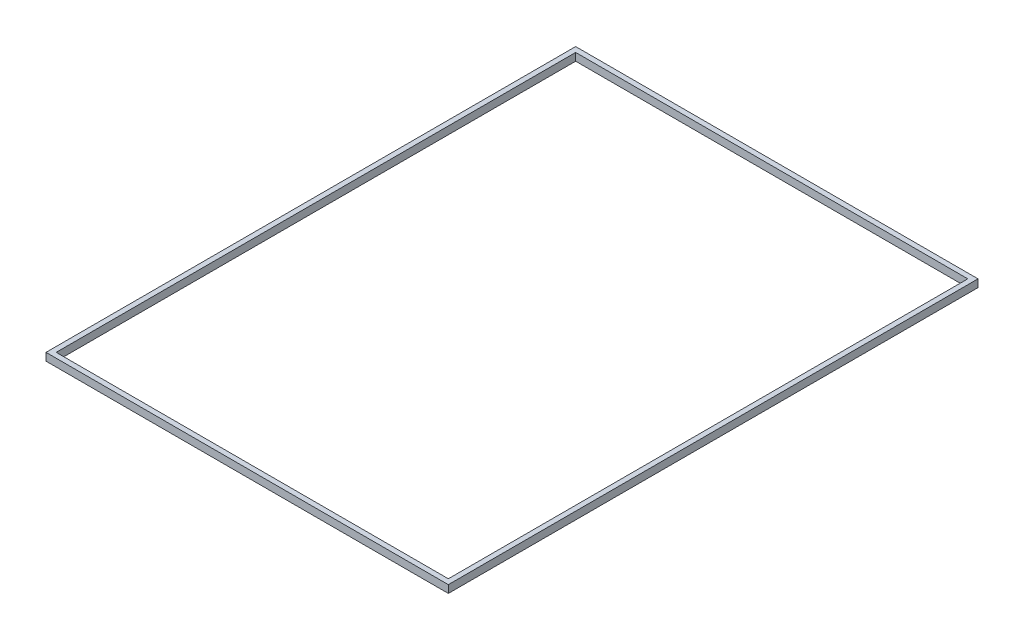
ISO-10303-21;
HEADER;
FILE_DESCRIPTION(('STEP AP214'),'2;1');
FILE_NAME('part.step','',(''),(''),'','','');
FILE_SCHEMA(('AUTOMOTIVE_DESIGN { 1 0 10303 214 1 1 1 1 }'));
ENDSEC;
DATA;
#1=APPLICATION_CONTEXT('core data for automotive mechanical design processes');
#2=APPLICATION_PROTOCOL_DEFINITION('international standard','automotive_design',2000,#1);
#3=PRODUCT_CONTEXT('',#1,'mechanical');
#4=PRODUCT('Part','Part','',(#3));
#5=PRODUCT_RELATED_PRODUCT_CATEGORY('part','',(#4));
#6=PRODUCT_DEFINITION_FORMATION('','',#4);
#7=PRODUCT_DEFINITION_CONTEXT('part definition',#1,'design');
#8=PRODUCT_DEFINITION('design','',#6,#7);
#9=PRODUCT_DEFINITION_SHAPE('','',#8);
#10=(LENGTH_UNIT() NAMED_UNIT(*) SI_UNIT(.MILLI.,.METRE.));
#11=(NAMED_UNIT(*) PLANE_ANGLE_UNIT() SI_UNIT($,.RADIAN.));
#12=(NAMED_UNIT(*) SI_UNIT($,.STERADIAN.) SOLID_ANGLE_UNIT());
#13=UNCERTAINTY_MEASURE_WITH_UNIT(LENGTH_MEASURE(1.E-05),#10,'distance_accuracy_value','');
#14=(GEOMETRIC_REPRESENTATION_CONTEXT(3) GLOBAL_UNCERTAINTY_ASSIGNED_CONTEXT((#13)) GLOBAL_UNIT_ASSIGNED_CONTEXT((#10,
#11,#12)) REPRESENTATION_CONTEXT('',''));
#15=CARTESIAN_POINT('',(0.,0.,0.));
#16=DIRECTION('',(0.,0.,1.));
#17=DIRECTION('',(1.,0.,0.));
#18=AXIS2_PLACEMENT_3D('',#15,#16,#17);
#19=CARTESIAN_POINT('',(0.,300.,0.));
#20=DIRECTION('',(0.,-1.,0.));
#21=DIRECTION('',(0.,0.,-1.));
#22=AXIS2_PLACEMENT_3D('',#19,#20,#21);
#23=PLANE('',#22);
#24=DIRECTION('',(-1.,0.,0.));
#25=VECTOR('',#24,1.);
#26=CARTESIAN_POINT('',(-200.,300.,-200.));
#27=LINE('',#26,#25);
#28=CARTESIAN_POINT('',(15600.,300.,-200.));
#29=VERTEX_POINT('',#28);
#30=CARTESIAN_POINT('',(-200.,300.,-200.));
#31=VERTEX_POINT('',#30);
#32=EDGE_CURVE('E134',#29,#31,#27,.T.);
#33=ORIENTED_EDGE('',*,*,#32,.T.);
#34=DIRECTION('',(0.,0.,1.));
#35=VECTOR('',#34,1.);
#36=CARTESIAN_POINT('',(-200.,300.,-200.));
#37=LINE('',#36,#35);
#38=CARTESIAN_POINT('',(-200.,300.,20600.));
#39=VERTEX_POINT('',#38);
#40=EDGE_CURVE('E137',#31,#39,#37,.T.);
#41=ORIENTED_EDGE('',*,*,#40,.T.);
#42=DIRECTION('',(1.,0.,0.));
#43=VECTOR('',#42,1.);
#44=CARTESIAN_POINT('',(-200.,300.,20600.));
#45=LINE('',#44,#43);
#46=CARTESIAN_POINT('',(15600.,300.,20600.));
#47=VERTEX_POINT('',#46);
#48=EDGE_CURVE('E140',#39,#47,#45,.T.);
#49=ORIENTED_EDGE('',*,*,#48,.T.);
#50=DIRECTION('',(0.,0.,-1.));
#51=VECTOR('',#50,1.);
#52=CARTESIAN_POINT('',(15600.,300.,-200.));
#53=LINE('',#52,#51);
#54=EDGE_CURVE('E142',#47,#29,#53,.T.);
#55=ORIENTED_EDGE('',*,*,#54,.T.);
#56=EDGE_LOOP('',(#33,#41,#49,#55));
#57=FACE_BOUND('',#56,.T.);
#58=DIRECTION('',(0.,0.,1.));
#59=VECTOR('',#58,1.);
#60=CARTESIAN_POINT('',(0.,300.,0.));
#61=LINE('',#60,#59);
#62=CARTESIAN_POINT('',(0.,300.,0.));
#63=VERTEX_POINT('',#62);
#64=CARTESIAN_POINT('',(0.,300.,20400.));
#65=VERTEX_POINT('',#64);
#66=EDGE_CURVE('E98',#63,#65,#61,.T.);
#67=ORIENTED_EDGE('',*,*,#66,.F.);
#68=DIRECTION('',(-1.,0.,0.));
#69=VECTOR('',#68,1.);
#70=CARTESIAN_POINT('',(0.,300.,0.));
#71=LINE('',#70,#69);
#72=CARTESIAN_POINT('',(15400.,300.,0.));
#73=VERTEX_POINT('',#72);
#74=EDGE_CURVE('E120',#73,#63,#71,.T.);
#75=ORIENTED_EDGE('',*,*,#74,.F.);
#76=DIRECTION('',(0.,0.,-1.));
#77=VECTOR('',#76,1.);
#78=CARTESIAN_POINT('',(15400.,300.,0.));
#79=LINE('',#78,#77);
#80=CARTESIAN_POINT('',(15400.,300.,20400.));
#81=VERTEX_POINT('',#80);
#82=EDGE_CURVE('E118',#81,#73,#79,.T.);
#83=ORIENTED_EDGE('',*,*,#82,.F.);
#84=DIRECTION('',(1.,0.,0.));
#85=VECTOR('',#84,1.);
#86=CARTESIAN_POINT('',(0.,300.,20400.));
#87=LINE('',#86,#85);
#88=EDGE_CURVE('E106',#65,#81,#87,.T.);
#89=ORIENTED_EDGE('',*,*,#88,.F.);
#90=EDGE_LOOP('',(#67,#75,#83,#89));
#91=FACE_BOUND('',#90,.T.);
#92=ADVANCED_FACE('F33',(#57,#91),#23,.F.);
#93=CARTESIAN_POINT('',(0.,0.,0.));
#94=DIRECTION('',(0.,-1.,0.));
#95=DIRECTION('',(0.,0.,-1.));
#96=AXIS2_PLACEMENT_3D('',#93,#94,#95);
#97=PLANE('',#96);
#98=DIRECTION('',(-1.,0.,0.));
#99=VECTOR('',#98,1.);
#100=CARTESIAN_POINT('',(-200.,0.,-200.));
#101=LINE('',#100,#99);
#102=CARTESIAN_POINT('',(15600.,0.,-200.));
#103=VERTEX_POINT('',#102);
#104=CARTESIAN_POINT('',(-200.,0.,-200.));
#105=VERTEX_POINT('',#104);
#106=EDGE_CURVE('E114',#103,#105,#101,.T.);
#107=ORIENTED_EDGE('',*,*,#106,.F.);
#108=DIRECTION('',(0.,0.,-1.));
#109=VECTOR('',#108,1.);
#110=CARTESIAN_POINT('',(15600.,0.,-200.));
#111=LINE('',#110,#109);
#112=CARTESIAN_POINT('',(15600.,0.,20600.));
#113=VERTEX_POINT('',#112);
#114=EDGE_CURVE('E138',#113,#103,#111,.T.);
#115=ORIENTED_EDGE('',*,*,#114,.F.);
#116=DIRECTION('',(1.,0.,0.));
#117=VECTOR('',#116,1.);
#118=CARTESIAN_POINT('',(-200.,0.,20600.));
#119=LINE('',#118,#117);
#120=CARTESIAN_POINT('',(-200.,0.,20600.));
#121=VERTEX_POINT('',#120);
#122=EDGE_CURVE('E149',#121,#113,#119,.T.);
#123=ORIENTED_EDGE('',*,*,#122,.F.);
#124=DIRECTION('',(0.,0.,1.));
#125=VECTOR('',#124,1.);
#126=CARTESIAN_POINT('',(-200.,0.,-200.));
#127=LINE('',#126,#125);
#128=EDGE_CURVE('E147',#105,#121,#127,.T.);
#129=ORIENTED_EDGE('',*,*,#128,.F.);
#130=EDGE_LOOP('',(#107,#115,#123,#129));
#131=FACE_BOUND('',#130,.T.);
#132=DIRECTION('',(-1.,0.,0.));
#133=VECTOR('',#132,1.);
#134=CARTESIAN_POINT('',(0.,0.,0.));
#135=LINE('',#134,#133);
#136=CARTESIAN_POINT('',(15400.,0.,0.));
#137=VERTEX_POINT('',#136);
#138=CARTESIAN_POINT('',(0.,0.,0.));
#139=VERTEX_POINT('',#138);
#140=EDGE_CURVE('E107',#137,#139,#135,.T.);
#141=ORIENTED_EDGE('',*,*,#140,.T.);
#142=DIRECTION('',(0.,0.,1.));
#143=VECTOR('',#142,1.);
#144=CARTESIAN_POINT('',(0.,0.,0.));
#145=LINE('',#144,#143);
#146=CARTESIAN_POINT('',(0.,0.,20400.));
#147=VERTEX_POINT('',#146);
#148=EDGE_CURVE('E56',#139,#147,#145,.T.);
#149=ORIENTED_EDGE('',*,*,#148,.T.);
#150=DIRECTION('',(1.,0.,0.));
#151=VECTOR('',#150,1.);
#152=CARTESIAN_POINT('',(0.,0.,20400.));
#153=LINE('',#152,#151);
#154=CARTESIAN_POINT('',(15400.,0.,20400.));
#155=VERTEX_POINT('',#154);
#156=EDGE_CURVE('E113',#147,#155,#153,.T.);
#157=ORIENTED_EDGE('',*,*,#156,.T.);
#158=DIRECTION('',(0.,0.,-1.));
#159=VECTOR('',#158,1.);
#160=CARTESIAN_POINT('',(15400.,0.,0.));
#161=LINE('',#160,#159);
#162=EDGE_CURVE('E126',#155,#137,#161,.T.);
#163=ORIENTED_EDGE('',*,*,#162,.T.);
#164=EDGE_LOOP('',(#141,#149,#157,#163));
#165=FACE_BOUND('',#164,.T.);
#166=ADVANCED_FACE('F167',(#131,#165),#97,.T.);
#167=CARTESIAN_POINT('',(-200.,300.,-200.));
#168=DIRECTION('',(0.,0.,1.));
#169=DIRECTION('',(1.,0.,0.));
#170=AXIS2_PLACEMENT_3D('',#167,#168,#169);
#171=PLANE('',#170);
#172=ORIENTED_EDGE('',*,*,#106,.T.);
#173=DIRECTION('',(0.,-1.,0.));
#174=VECTOR('',#173,1.);
#175=CARTESIAN_POINT('',(-200.,300.,-200.));
#176=LINE('',#175,#174);
#177=EDGE_CURVE('E11',#31,#105,#176,.T.);
#178=ORIENTED_EDGE('',*,*,#177,.F.);
#179=ORIENTED_EDGE('',*,*,#32,.F.);
#180=DIRECTION('',(0.,-1.,0.));
#181=VECTOR('',#180,1.);
#182=CARTESIAN_POINT('',(15600.,300.,-200.));
#183=LINE('',#182,#181);
#184=EDGE_CURVE('E144',#29,#103,#183,.T.);
#185=ORIENTED_EDGE('',*,*,#184,.T.);
#186=EDGE_LOOP('',(#172,#178,#179,#185));
#187=FACE_BOUND('',#186,.T.);
#188=ADVANCED_FACE('F35',(#187),#171,.F.);
#189=CARTESIAN_POINT('',(-200.,300.,-200.));
#190=DIRECTION('',(1.,0.,0.));
#191=DIRECTION('',(0.,0.,-1.));
#192=AXIS2_PLACEMENT_3D('',#189,#190,#191);
#193=PLANE('',#192);
#194=ORIENTED_EDGE('',*,*,#128,.T.);
#195=DIRECTION('',(0.,-1.,0.));
#196=VECTOR('',#195,1.);
#197=CARTESIAN_POINT('',(-200.,300.,20600.));
#198=LINE('',#197,#196);
#199=EDGE_CURVE('E41',#39,#121,#198,.T.);
#200=ORIENTED_EDGE('',*,*,#199,.F.);
#201=ORIENTED_EDGE('',*,*,#40,.F.);
#202=ORIENTED_EDGE('',*,*,#177,.T.);
#203=EDGE_LOOP('',(#194,#200,#201,#202));
#204=FACE_BOUND('',#203,.T.);
#205=ADVANCED_FACE('F177',(#204),#193,.F.);
#206=CARTESIAN_POINT('',(-200.,300.,20600.));
#207=DIRECTION('',(0.,0.,-1.));
#208=DIRECTION('',(-1.,0.,0.));
#209=AXIS2_PLACEMENT_3D('',#206,#207,#208);
#210=PLANE('',#209);
#211=ORIENTED_EDGE('',*,*,#122,.T.);
#212=DIRECTION('',(0.,-1.,0.));
#213=VECTOR('',#212,1.);
#214=CARTESIAN_POINT('',(15600.,300.,20600.));
#215=LINE('',#214,#213);
#216=EDGE_CURVE('E154',#47,#113,#215,.T.);
#217=ORIENTED_EDGE('',*,*,#216,.F.);
#218=ORIENTED_EDGE('',*,*,#48,.F.);
#219=ORIENTED_EDGE('',*,*,#199,.T.);
#220=EDGE_LOOP('',(#211,#217,#218,#219));
#221=FACE_BOUND('',#220,.T.);
#222=ADVANCED_FACE('F161',(#221),#210,.F.);
#223=CARTESIAN_POINT('',(15600.,300.,-200.));
#224=DIRECTION('',(-1.,0.,0.));
#225=DIRECTION('',(0.,0.,1.));
#226=AXIS2_PLACEMENT_3D('',#223,#224,#225);
#227=PLANE('',#226);
#228=ORIENTED_EDGE('',*,*,#114,.T.);
#229=ORIENTED_EDGE('',*,*,#184,.F.);
#230=ORIENTED_EDGE('',*,*,#54,.F.);
#231=ORIENTED_EDGE('',*,*,#216,.T.);
#232=EDGE_LOOP('',(#228,#229,#230,#231));
#233=FACE_BOUND('',#232,.T.);
#234=ADVANCED_FACE('F171',(#233),#227,.F.);
#235=CARTESIAN_POINT('',(0.,300.,0.));
#236=DIRECTION('',(1.,0.,0.));
#237=DIRECTION('',(0.,0.,-1.));
#238=AXIS2_PLACEMENT_3D('',#235,#236,#237);
#239=PLANE('',#238);
#240=ORIENTED_EDGE('',*,*,#148,.F.);
#241=DIRECTION('',(0.,-1.,0.));
#242=VECTOR('',#241,1.);
#243=CARTESIAN_POINT('',(0.,300.,0.));
#244=LINE('',#243,#242);
#245=EDGE_CURVE('E102',#63,#139,#244,.T.);
#246=ORIENTED_EDGE('',*,*,#245,.F.);
#247=ORIENTED_EDGE('',*,*,#66,.T.);
#248=DIRECTION('',(0.,-1.,0.));
#249=VECTOR('',#248,1.);
#250=CARTESIAN_POINT('',(0.,300.,20400.));
#251=LINE('',#250,#249);
#252=EDGE_CURVE('E101',#65,#147,#251,.T.);
#253=ORIENTED_EDGE('',*,*,#252,.T.);
#254=EDGE_LOOP('',(#240,#246,#247,#253));
#255=FACE_BOUND('',#254,.T.);
#256=ADVANCED_FACE('F100',(#255),#239,.T.);
#257=CARTESIAN_POINT('',(0.,300.,20400.));
#258=DIRECTION('',(0.,0.,-1.));
#259=DIRECTION('',(-1.,0.,0.));
#260=AXIS2_PLACEMENT_3D('',#257,#258,#259);
#261=PLANE('',#260);
#262=ORIENTED_EDGE('',*,*,#156,.F.);
#263=ORIENTED_EDGE('',*,*,#252,.F.);
#264=ORIENTED_EDGE('',*,*,#88,.T.);
#265=DIRECTION('',(0.,-1.,0.));
#266=VECTOR('',#265,1.);
#267=CARTESIAN_POINT('',(15400.,300.,20400.));
#268=LINE('',#267,#266);
#269=EDGE_CURVE('E115',#81,#155,#268,.T.);
#270=ORIENTED_EDGE('',*,*,#269,.T.);
#271=EDGE_LOOP('',(#262,#263,#264,#270));
#272=FACE_BOUND('',#271,.T.);
#273=ADVANCED_FACE('F110',(#272),#261,.T.);
#274=CARTESIAN_POINT('',(15400.,300.,0.));
#275=DIRECTION('',(-1.,0.,0.));
#276=DIRECTION('',(0.,0.,1.));
#277=AXIS2_PLACEMENT_3D('',#274,#275,#276);
#278=PLANE('',#277);
#279=ORIENTED_EDGE('',*,*,#162,.F.);
#280=ORIENTED_EDGE('',*,*,#269,.F.);
#281=ORIENTED_EDGE('',*,*,#82,.T.);
#282=DIRECTION('',(0.,-1.,0.));
#283=VECTOR('',#282,1.);
#284=CARTESIAN_POINT('',(15400.,300.,0.));
#285=LINE('',#284,#283);
#286=EDGE_CURVE('E48',#73,#137,#285,.T.);
#287=ORIENTED_EDGE('',*,*,#286,.T.);
#288=EDGE_LOOP('',(#279,#280,#281,#287));
#289=FACE_BOUND('',#288,.T.);
#290=ADVANCED_FACE('F200',(#289),#278,.T.);
#291=CARTESIAN_POINT('',(0.,300.,0.));
#292=DIRECTION('',(0.,0.,1.));
#293=DIRECTION('',(1.,0.,0.));
#294=AXIS2_PLACEMENT_3D('',#291,#292,#293);
#295=PLANE('',#294);
#296=ORIENTED_EDGE('',*,*,#140,.F.);
#297=ORIENTED_EDGE('',*,*,#286,.F.);
#298=ORIENTED_EDGE('',*,*,#74,.T.);
#299=ORIENTED_EDGE('',*,*,#245,.T.);
#300=EDGE_LOOP('',(#296,#297,#298,#299));
#301=FACE_BOUND('',#300,.T.);
#302=ADVANCED_FACE('F204',(#301),#295,.T.);
#303=CLOSED_SHELL('',(#92,#166,#188,#205,#222,#234,#256,#273,#290,#302));
#304=MANIFOLD_SOLID_BREP('B2',#303);
#305=ADVANCED_BREP_SHAPE_REPRESENTATION('',(#18,#304),#14);
#306=SHAPE_DEFINITION_REPRESENTATION(#9,#305);
ENDSEC;
END-ISO-10303-21;
